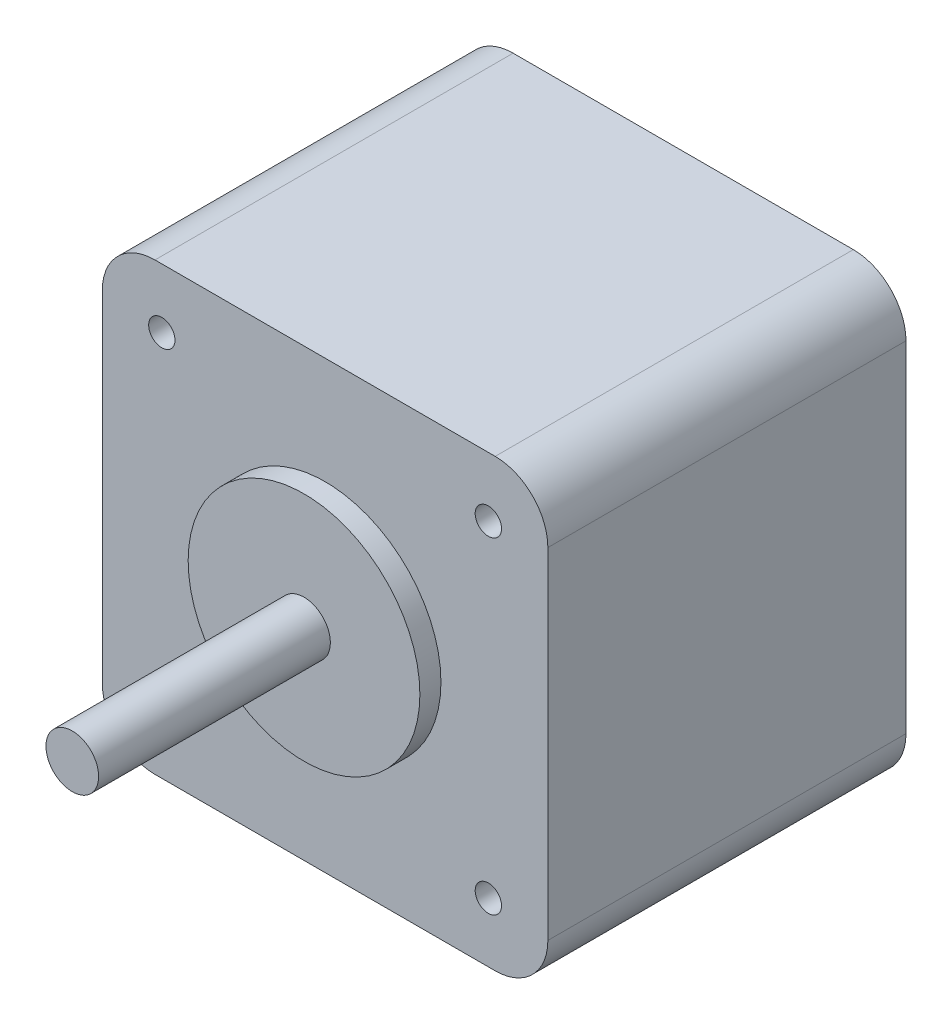
ISO-10303-21;
HEADER;
FILE_DESCRIPTION(('STEP AP214'),'2;1');
FILE_NAME('part.step','',(''),(''),'','','');
FILE_SCHEMA(('AUTOMOTIVE_DESIGN { 1 0 10303 214 1 1 1 1 }'));
ENDSEC;
DATA;
#1=APPLICATION_CONTEXT('core data for automotive mechanical design processes');
#2=APPLICATION_PROTOCOL_DEFINITION('international standard','automotive_design',2000,#1);
#3=PRODUCT_CONTEXT('',#1,'mechanical');
#4=PRODUCT('Part','Part','',(#3));
#5=PRODUCT_RELATED_PRODUCT_CATEGORY('part','',(#4));
#6=PRODUCT_DEFINITION_FORMATION('','',#4);
#7=PRODUCT_DEFINITION_CONTEXT('part definition',#1,'design');
#8=PRODUCT_DEFINITION('design','',#6,#7);
#9=PRODUCT_DEFINITION_SHAPE('','',#8);
#10=(LENGTH_UNIT() NAMED_UNIT(*) SI_UNIT(.MILLI.,.METRE.));
#11=(NAMED_UNIT(*) PLANE_ANGLE_UNIT() SI_UNIT($,.RADIAN.));
#12=(NAMED_UNIT(*) SI_UNIT($,.STERADIAN.) SOLID_ANGLE_UNIT());
#13=UNCERTAINTY_MEASURE_WITH_UNIT(LENGTH_MEASURE(1.E-05),#10,'distance_accuracy_value','');
#14=(GEOMETRIC_REPRESENTATION_CONTEXT(3) GLOBAL_UNCERTAINTY_ASSIGNED_CONTEXT((#13)) GLOBAL_UNIT_ASSIGNED_CONTEXT((#10,
#11,#12)) REPRESENTATION_CONTEXT('',''));
#15=CARTESIAN_POINT('',(0.,0.,0.));
#16=DIRECTION('',(0.,0.,1.));
#17=DIRECTION('',(1.,0.,0.));
#18=AXIS2_PLACEMENT_3D('',#15,#16,#17);
#19=CARTESIAN_POINT('',(21.15,21.15,36.));
#20=DIRECTION('',(0.,0.,1.));
#21=DIRECTION('',(1.,0.,0.));
#22=AXIS2_PLACEMENT_3D('',#19,#20,#21);
#23=PLANE('',#22);
#24=CARTESIAN_POINT('',(21.15,21.15,36.));
#25=DIRECTION('',(0.,0.,1.));
#26=DIRECTION('',(1.,0.,0.));
#27=AXIS2_PLACEMENT_3D('',#24,#25,#26);
#28=CIRCLE('',#27,11.);
#29=CARTESIAN_POINT('',(32.15,21.15,36.));
#30=VERTEX_POINT('',#29);
#31=EDGE_CURVE('E144',#30,#30,#28,.T.);
#32=ORIENTED_EDGE('',*,*,#31,.T.);
#33=EDGE_LOOP('',(#32));
#34=FACE_BOUND('',#33,.T.);
#35=CARTESIAN_POINT('',(21.15,21.15,36.));
#36=DIRECTION('',(0.,0.,1.));
#37=DIRECTION('',(1.,0.,0.));
#38=AXIS2_PLACEMENT_3D('',#35,#36,#37);
#39=CIRCLE('',#38,2.5);
#40=CARTESIAN_POINT('',(23.65,21.15,36.));
#41=VERTEX_POINT('',#40);
#42=EDGE_CURVE('E195',#41,#41,#39,.T.);
#43=ORIENTED_EDGE('',*,*,#42,.F.);
#44=EDGE_LOOP('',(#43));
#45=FACE_BOUND('',#44,.T.);
#46=ADVANCED_FACE('F38',(#34,#45),#23,.T.);
#47=CARTESIAN_POINT('',(5.,5.,34.));
#48=DIRECTION('',(0.,0.,-1.));
#49=DIRECTION('',(-1.,0.,0.));
#50=AXIS2_PLACEMENT_3D('',#47,#48,#49);
#51=PLANE('',#50);
#52=CARTESIAN_POINT('',(5.65,36.65,34.));
#53=DIRECTION('',(0.,0.,1.));
#54=DIRECTION('',(1.,0.,0.));
#55=AXIS2_PLACEMENT_3D('',#52,#53,#54);
#56=CIRCLE('',#55,1.25);
#57=CARTESIAN_POINT('',(6.89999999999999,36.65,34.));
#58=VERTEX_POINT('',#57);
#59=EDGE_CURVE('E221',#58,#58,#56,.T.);
#60=ORIENTED_EDGE('',*,*,#59,.F.);
#61=EDGE_LOOP('',(#60));
#62=FACE_BOUND('',#61,.T.);
#63=CARTESIAN_POINT('',(36.65,36.65,34.));
#64=DIRECTION('',(0.,0.,1.));
#65=DIRECTION('',(1.,0.,0.));
#66=AXIS2_PLACEMENT_3D('',#63,#64,#65);
#67=CIRCLE('',#66,1.25);
#68=CARTESIAN_POINT('',(37.9,36.65,34.));
#69=VERTEX_POINT('',#68);
#70=EDGE_CURVE('E215',#69,#69,#67,.T.);
#71=ORIENTED_EDGE('',*,*,#70,.F.);
#72=EDGE_LOOP('',(#71));
#73=FACE_BOUND('',#72,.T.);
#74=CARTESIAN_POINT('',(36.65,5.65,34.));
#75=DIRECTION('',(0.,0.,1.));
#76=DIRECTION('',(1.,0.,0.));
#77=AXIS2_PLACEMENT_3D('',#74,#75,#76);
#78=CIRCLE('',#77,1.25);
#79=CARTESIAN_POINT('',(37.9,5.65,34.));
#80=VERTEX_POINT('',#79);
#81=EDGE_CURVE('E209',#80,#80,#78,.T.);
#82=ORIENTED_EDGE('',*,*,#81,.F.);
#83=EDGE_LOOP('',(#82));
#84=FACE_BOUND('',#83,.T.);
#85=CARTESIAN_POINT('',(5.65,5.65,34.));
#86=DIRECTION('',(0.,0.,1.));
#87=DIRECTION('',(1.,0.,0.));
#88=AXIS2_PLACEMENT_3D('',#85,#86,#87);
#89=CIRCLE('',#88,1.25);
#90=CARTESIAN_POINT('',(6.89999999999999,5.65,34.));
#91=VERTEX_POINT('',#90);
#92=EDGE_CURVE('E203',#91,#91,#89,.T.);
#93=ORIENTED_EDGE('',*,*,#92,.F.);
#94=EDGE_LOOP('',(#93));
#95=FACE_BOUND('',#94,.T.);
#96=CARTESIAN_POINT('',(5.,5.,34.));
#97=DIRECTION('',(0.,0.,1.));
#98=DIRECTION('',(-1.,0.,0.));
#99=AXIS2_PLACEMENT_3D('',#96,#97,#98);
#100=CIRCLE('',#99,5.);
#101=CARTESIAN_POINT('',(0.,5.00000000000004,34.));
#102=VERTEX_POINT('',#101);
#103=CARTESIAN_POINT('',(5.00000000000004,0.,34.));
#104=VERTEX_POINT('',#103);
#105=EDGE_CURVE('E155',#102,#104,#100,.T.);
#106=ORIENTED_EDGE('',*,*,#105,.T.);
#107=DIRECTION('',(1.,0.,0.));
#108=VECTOR('',#107,1.);
#109=CARTESIAN_POINT('',(5.00000000000004,0.,34.));
#110=LINE('',#109,#108);
#111=CARTESIAN_POINT('',(37.3,0.,34.));
#112=VERTEX_POINT('',#111);
#113=EDGE_CURVE('E100',#104,#112,#110,.T.);
#114=ORIENTED_EDGE('',*,*,#113,.T.);
#115=CARTESIAN_POINT('',(37.3,5.,34.));
#116=DIRECTION('',(0.,0.,1.));
#117=DIRECTION('',(1.,0.,0.));
#118=AXIS2_PLACEMENT_3D('',#115,#116,#117);
#119=CIRCLE('',#118,5.);
#120=CARTESIAN_POINT('',(42.3,5.00000000000004,34.));
#121=VERTEX_POINT('',#120);
#122=EDGE_CURVE('E186',#112,#121,#119,.T.);
#123=ORIENTED_EDGE('',*,*,#122,.T.);
#124=DIRECTION('',(0.,1.,0.));
#125=VECTOR('',#124,1.);
#126=CARTESIAN_POINT('',(42.3,5.00000000000004,34.));
#127=LINE('',#126,#125);
#128=CARTESIAN_POINT('',(42.3,37.3,34.));
#129=VERTEX_POINT('',#128);
#130=EDGE_CURVE('E185',#121,#129,#127,.T.);
#131=ORIENTED_EDGE('',*,*,#130,.T.);
#132=CARTESIAN_POINT('',(37.3,37.3,34.));
#133=DIRECTION('',(0.,0.,1.));
#134=DIRECTION('',(-1.,0.,0.));
#135=AXIS2_PLACEMENT_3D('',#132,#133,#134);
#136=CIRCLE('',#135,5.);
#137=CARTESIAN_POINT('',(37.3,42.3,34.));
#138=VERTEX_POINT('',#137);
#139=EDGE_CURVE('E122',#129,#138,#136,.T.);
#140=ORIENTED_EDGE('',*,*,#139,.T.);
#141=DIRECTION('',(-1.,0.,0.));
#142=VECTOR('',#141,1.);
#143=CARTESIAN_POINT('',(5.00000000000003,42.3,34.));
#144=LINE('',#143,#142);
#145=CARTESIAN_POINT('',(5.00000000000003,42.3,34.));
#146=VERTEX_POINT('',#145);
#147=EDGE_CURVE('E115',#138,#146,#144,.T.);
#148=ORIENTED_EDGE('',*,*,#147,.T.);
#149=CARTESIAN_POINT('',(5.,37.3,34.));
#150=DIRECTION('',(0.,0.,1.));
#151=DIRECTION('',(-1.,0.,0.));
#152=AXIS2_PLACEMENT_3D('',#149,#150,#151);
#153=CIRCLE('',#152,5.);
#154=CARTESIAN_POINT('',(0.,37.3,34.));
#155=VERTEX_POINT('',#154);
#156=EDGE_CURVE('E120',#146,#155,#153,.T.);
#157=ORIENTED_EDGE('',*,*,#156,.T.);
#158=DIRECTION('',(0.,-1.,0.));
#159=VECTOR('',#158,1.);
#160=CARTESIAN_POINT('',(0.,5.00000000000004,34.));
#161=LINE('',#160,#159);
#162=EDGE_CURVE('E55',#155,#102,#161,.T.);
#163=ORIENTED_EDGE('',*,*,#162,.T.);
#164=EDGE_LOOP('',(#106,#114,#123,#131,#140,#148,#157,#163));
#165=FACE_BOUND('',#164,.T.);
#166=CARTESIAN_POINT('',(21.15,21.15,34.));
#167=DIRECTION('',(0.,0.,-1.));
#168=DIRECTION('',(-1.,0.,0.));
#169=AXIS2_PLACEMENT_3D('',#166,#167,#168);
#170=CIRCLE('',#169,11.);
#171=CARTESIAN_POINT('',(10.15,21.15,34.));
#172=VERTEX_POINT('',#171);
#173=EDGE_CURVE('E11',#172,#172,#170,.F.);
#174=ORIENTED_EDGE('',*,*,#173,.F.);
#175=EDGE_LOOP('',(#174));
#176=FACE_BOUND('',#175,.T.);
#177=ADVANCED_FACE('F117',(#62,#73,#84,#95,#165,#176),#51,.F.);
#178=CARTESIAN_POINT('',(5.,5.,34.));
#179=DIRECTION('',(0.,0.,-1.));
#180=DIRECTION('',(-1.,0.,0.));
#181=AXIS2_PLACEMENT_3D('',#178,#179,#180);
#182=CYLINDRICAL_SURFACE('',#181,5.);
#183=CARTESIAN_POINT('',(5.,5.,0.));
#184=DIRECTION('',(0.,0.,1.));
#185=DIRECTION('',(-1.,0.,0.));
#186=AXIS2_PLACEMENT_3D('',#183,#184,#185);
#187=CIRCLE('',#186,5.);
#188=CARTESIAN_POINT('',(0.,5.00000000000004,0.));
#189=VERTEX_POINT('',#188);
#190=CARTESIAN_POINT('',(5.00000000000004,0.,0.));
#191=VERTEX_POINT('',#190);
#192=EDGE_CURVE('E140',#189,#191,#187,.T.);
#193=ORIENTED_EDGE('',*,*,#192,.T.);
#194=DIRECTION('',(0.,0.,-1.));
#195=VECTOR('',#194,1.);
#196=CARTESIAN_POINT('',(5.00000000000004,0.,34.));
#197=LINE('',#196,#195);
#198=EDGE_CURVE('E47',#104,#191,#197,.T.);
#199=ORIENTED_EDGE('',*,*,#198,.F.);
#200=ORIENTED_EDGE('',*,*,#105,.F.);
#201=DIRECTION('',(0.,0.,-1.));
#202=VECTOR('',#201,1.);
#203=CARTESIAN_POINT('',(0.,5.00000000000004,34.));
#204=LINE('',#203,#202);
#205=EDGE_CURVE('E136',#102,#189,#204,.T.);
#206=ORIENTED_EDGE('',*,*,#205,.T.);
#207=EDGE_LOOP('',(#193,#199,#200,#206));
#208=FACE_BOUND('',#207,.T.);
#209=ADVANCED_FACE('F40',(#208),#182,.T.);
#210=CARTESIAN_POINT('',(5.00000000000004,0.,34.));
#211=DIRECTION('',(0.,1.,0.));
#212=DIRECTION('',(0.,0.,1.));
#213=AXIS2_PLACEMENT_3D('',#210,#211,#212);
#214=PLANE('',#213);
#215=DIRECTION('',(1.,0.,0.));
#216=VECTOR('',#215,1.);
#217=CARTESIAN_POINT('',(5.00000000000004,0.,0.));
#218=LINE('',#217,#216);
#219=CARTESIAN_POINT('',(37.3,0.,0.));
#220=VERTEX_POINT('',#219);
#221=EDGE_CURVE('E143',#191,#220,#218,.T.);
#222=ORIENTED_EDGE('',*,*,#221,.T.);
#223=DIRECTION('',(0.,0.,-1.));
#224=VECTOR('',#223,1.);
#225=CARTESIAN_POINT('',(37.3,0.,34.));
#226=LINE('',#225,#224);
#227=EDGE_CURVE('E165',#112,#220,#226,.T.);
#228=ORIENTED_EDGE('',*,*,#227,.F.);
#229=ORIENTED_EDGE('',*,*,#113,.F.);
#230=ORIENTED_EDGE('',*,*,#198,.T.);
#231=EDGE_LOOP('',(#222,#228,#229,#230));
#232=FACE_BOUND('',#231,.T.);
#233=ADVANCED_FACE('F168',(#232),#214,.F.);
#234=CARTESIAN_POINT('',(37.3,5.,34.));
#235=DIRECTION('',(0.,0.,-1.));
#236=DIRECTION('',(-1.,0.,0.));
#237=AXIS2_PLACEMENT_3D('',#234,#235,#236);
#238=CYLINDRICAL_SURFACE('',#237,5.);
#239=CARTESIAN_POINT('',(37.3,5.,0.));
#240=DIRECTION('',(0.,0.,1.));
#241=DIRECTION('',(1.,0.,0.));
#242=AXIS2_PLACEMENT_3D('',#239,#240,#241);
#243=CIRCLE('',#242,5.);
#244=CARTESIAN_POINT('',(42.3,5.00000000000004,0.));
#245=VERTEX_POINT('',#244);
#246=EDGE_CURVE('E146',#220,#245,#243,.T.);
#247=ORIENTED_EDGE('',*,*,#246,.T.);
#248=DIRECTION('',(0.,0.,-1.));
#249=VECTOR('',#248,1.);
#250=CARTESIAN_POINT('',(42.3,5.00000000000004,34.));
#251=LINE('',#250,#249);
#252=EDGE_CURVE('E162',#121,#245,#251,.T.);
#253=ORIENTED_EDGE('',*,*,#252,.F.);
#254=ORIENTED_EDGE('',*,*,#122,.F.);
#255=ORIENTED_EDGE('',*,*,#227,.T.);
#256=EDGE_LOOP('',(#247,#253,#254,#255));
#257=FACE_BOUND('',#256,.T.);
#258=ADVANCED_FACE('F179',(#257),#238,.T.);
#259=CARTESIAN_POINT('',(42.3,5.00000000000004,34.));
#260=DIRECTION('',(-1.,0.,0.));
#261=DIRECTION('',(0.,0.,1.));
#262=AXIS2_PLACEMENT_3D('',#259,#260,#261);
#263=PLANE('',#262);
#264=DIRECTION('',(0.,1.,0.));
#265=VECTOR('',#264,1.);
#266=CARTESIAN_POINT('',(42.3,5.00000000000004,0.));
#267=LINE('',#266,#265);
#268=CARTESIAN_POINT('',(42.3,37.3,0.));
#269=VERTEX_POINT('',#268);
#270=EDGE_CURVE('E148',#245,#269,#267,.T.);
#271=ORIENTED_EDGE('',*,*,#270,.T.);
#272=DIRECTION('',(0.,0.,-1.));
#273=VECTOR('',#272,1.);
#274=CARTESIAN_POINT('',(42.3,37.3,34.));
#275=LINE('',#274,#273);
#276=EDGE_CURVE('E159',#129,#269,#275,.T.);
#277=ORIENTED_EDGE('',*,*,#276,.F.);
#278=ORIENTED_EDGE('',*,*,#130,.F.);
#279=ORIENTED_EDGE('',*,*,#252,.T.);
#280=EDGE_LOOP('',(#271,#277,#278,#279));
#281=FACE_BOUND('',#280,.T.);
#282=ADVANCED_FACE('F183',(#281),#263,.F.);
#283=CARTESIAN_POINT('',(37.3,37.3,34.));
#284=DIRECTION('',(0.,0.,-1.));
#285=DIRECTION('',(-1.,0.,0.));
#286=AXIS2_PLACEMENT_3D('',#283,#284,#285);
#287=CYLINDRICAL_SURFACE('',#286,5.);
#288=CARTESIAN_POINT('',(37.3,37.3,0.));
#289=DIRECTION('',(0.,0.,1.));
#290=DIRECTION('',(-1.,0.,0.));
#291=AXIS2_PLACEMENT_3D('',#288,#289,#290);
#292=CIRCLE('',#291,5.);
#293=CARTESIAN_POINT('',(37.3,42.3,0.));
#294=VERTEX_POINT('',#293);
#295=EDGE_CURVE('E150',#269,#294,#292,.T.);
#296=ORIENTED_EDGE('',*,*,#295,.T.);
#297=DIRECTION('',(0.,0.,-1.));
#298=VECTOR('',#297,1.);
#299=CARTESIAN_POINT('',(37.3,42.3,34.));
#300=LINE('',#299,#298);
#301=EDGE_CURVE('E131',#138,#294,#300,.T.);
#302=ORIENTED_EDGE('',*,*,#301,.F.);
#303=ORIENTED_EDGE('',*,*,#139,.F.);
#304=ORIENTED_EDGE('',*,*,#276,.T.);
#305=EDGE_LOOP('',(#296,#302,#303,#304));
#306=FACE_BOUND('',#305,.T.);
#307=ADVANCED_FACE('F276',(#306),#287,.T.);
#308=CARTESIAN_POINT('',(5.00000000000003,42.3,34.));
#309=DIRECTION('',(0.,-1.,0.));
#310=DIRECTION('',(0.,0.,-1.));
#311=AXIS2_PLACEMENT_3D('',#308,#309,#310);
#312=PLANE('',#311);
#313=DIRECTION('',(-1.,0.,0.));
#314=VECTOR('',#313,1.);
#315=CARTESIAN_POINT('',(5.00000000000003,42.3,0.));
#316=LINE('',#315,#314);
#317=CARTESIAN_POINT('',(5.00000000000003,42.3,0.));
#318=VERTEX_POINT('',#317);
#319=EDGE_CURVE('E130',#294,#318,#316,.T.);
#320=ORIENTED_EDGE('',*,*,#319,.T.);
#321=DIRECTION('',(0.,0.,-1.));
#322=VECTOR('',#321,1.);
#323=CARTESIAN_POINT('',(5.00000000000003,42.3,34.));
#324=LINE('',#323,#322);
#325=EDGE_CURVE('E127',#146,#318,#324,.T.);
#326=ORIENTED_EDGE('',*,*,#325,.F.);
#327=ORIENTED_EDGE('',*,*,#147,.F.);
#328=ORIENTED_EDGE('',*,*,#301,.T.);
#329=EDGE_LOOP('',(#320,#326,#327,#328));
#330=FACE_BOUND('',#329,.T.);
#331=ADVANCED_FACE('F128',(#330),#312,.F.);
#332=CARTESIAN_POINT('',(5.,37.3,34.));
#333=DIRECTION('',(0.,0.,-1.));
#334=DIRECTION('',(-1.,0.,0.));
#335=AXIS2_PLACEMENT_3D('',#332,#333,#334);
#336=CYLINDRICAL_SURFACE('',#335,5.);
#337=CARTESIAN_POINT('',(5.,37.3,0.));
#338=DIRECTION('',(0.,0.,1.));
#339=DIRECTION('',(-1.,0.,0.));
#340=AXIS2_PLACEMENT_3D('',#337,#338,#339);
#341=CIRCLE('',#340,5.);
#342=CARTESIAN_POINT('',(0.,37.3,0.));
#343=VERTEX_POINT('',#342);
#344=EDGE_CURVE('E85',#318,#343,#341,.T.);
#345=ORIENTED_EDGE('',*,*,#344,.T.);
#346=DIRECTION('',(0.,0.,-1.));
#347=VECTOR('',#346,1.);
#348=CARTESIAN_POINT('',(0.,37.3,34.));
#349=LINE('',#348,#347);
#350=EDGE_CURVE('E132',#155,#343,#349,.T.);
#351=ORIENTED_EDGE('',*,*,#350,.F.);
#352=ORIENTED_EDGE('',*,*,#156,.F.);
#353=ORIENTED_EDGE('',*,*,#325,.T.);
#354=EDGE_LOOP('',(#345,#351,#352,#353));
#355=FACE_BOUND('',#354,.T.);
#356=ADVANCED_FACE('F134',(#355),#336,.T.);
#357=CARTESIAN_POINT('',(0.,5.00000000000004,34.));
#358=DIRECTION('',(1.,0.,0.));
#359=DIRECTION('',(0.,0.,-1.));
#360=AXIS2_PLACEMENT_3D('',#357,#358,#359);
#361=PLANE('',#360);
#362=DIRECTION('',(0.,-1.,0.));
#363=VECTOR('',#362,1.);
#364=CARTESIAN_POINT('',(0.,5.00000000000004,0.));
#365=LINE('',#364,#363);
#366=EDGE_CURVE('E91',#343,#189,#365,.T.);
#367=ORIENTED_EDGE('',*,*,#366,.T.);
#368=ORIENTED_EDGE('',*,*,#205,.F.);
#369=ORIENTED_EDGE('',*,*,#162,.F.);
#370=ORIENTED_EDGE('',*,*,#350,.T.);
#371=EDGE_LOOP('',(#367,#368,#369,#370));
#372=FACE_BOUND('',#371,.T.);
#373=ADVANCED_FACE('F269',(#372),#361,.F.);
#374=CARTESIAN_POINT('',(5.,5.,0.));
#375=DIRECTION('',(0.,0.,-1.));
#376=DIRECTION('',(-1.,0.,0.));
#377=AXIS2_PLACEMENT_3D('',#374,#375,#376);
#378=PLANE('',#377);
#379=ORIENTED_EDGE('',*,*,#192,.F.);
#380=ORIENTED_EDGE('',*,*,#366,.F.);
#381=ORIENTED_EDGE('',*,*,#344,.F.);
#382=ORIENTED_EDGE('',*,*,#319,.F.);
#383=ORIENTED_EDGE('',*,*,#295,.F.);
#384=ORIENTED_EDGE('',*,*,#270,.F.);
#385=ORIENTED_EDGE('',*,*,#246,.F.);
#386=ORIENTED_EDGE('',*,*,#221,.F.);
#387=EDGE_LOOP('',(#379,#380,#381,#382,#383,#384,#385,#386));
#388=FACE_BOUND('',#387,.T.);
#389=ADVANCED_FACE('F173',(#388),#378,.T.);
#390=CARTESIAN_POINT('',(21.15,21.15,36.));
#391=DIRECTION('',(0.,0.,-1.));
#392=DIRECTION('',(-1.,0.,0.));
#393=AXIS2_PLACEMENT_3D('',#390,#391,#392);
#394=CYLINDRICAL_SURFACE('',#393,11.);
#395=ORIENTED_EDGE('',*,*,#31,.F.);
#396=EDGE_LOOP('',(#395));
#397=FACE_BOUND('',#396,.T.);
#398=ORIENTED_EDGE('',*,*,#173,.T.);
#399=EDGE_LOOP('',(#398));
#400=FACE_BOUND('',#399,.T.);
#401=ADVANCED_FACE('F263',(#397,#400),#394,.T.);
#402=CARTESIAN_POINT('',(21.15,21.15,58.));
#403=DIRECTION('',(0.,0.,-1.));
#404=DIRECTION('',(-1.,0.,0.));
#405=AXIS2_PLACEMENT_3D('',#402,#403,#404);
#406=CYLINDRICAL_SURFACE('',#405,2.5);
#407=CARTESIAN_POINT('',(21.15,21.15,58.));
#408=DIRECTION('',(0.,0.,1.));
#409=DIRECTION('',(1.,0.,0.));
#410=AXIS2_PLACEMENT_3D('',#407,#408,#409);
#411=CIRCLE('',#410,2.5);
#412=CARTESIAN_POINT('',(23.65,21.15,58.));
#413=VERTEX_POINT('',#412);
#414=EDGE_CURVE('E194',#413,#413,#411,.T.);
#415=ORIENTED_EDGE('',*,*,#414,.F.);
#416=EDGE_LOOP('',(#415));
#417=FACE_BOUND('',#416,.T.);
#418=ORIENTED_EDGE('',*,*,#42,.T.);
#419=EDGE_LOOP('',(#418));
#420=FACE_BOUND('',#419,.T.);
#421=ADVANCED_FACE('F261',(#417,#420),#406,.T.);
#422=CARTESIAN_POINT('',(21.15,21.15,58.));
#423=DIRECTION('',(0.,0.,1.));
#424=DIRECTION('',(1.,0.,0.));
#425=AXIS2_PLACEMENT_3D('',#422,#423,#424);
#426=PLANE('',#425);
#427=ORIENTED_EDGE('',*,*,#414,.T.);
#428=EDGE_LOOP('',(#427));
#429=FACE_BOUND('',#428,.T.);
#430=ADVANCED_FACE('F249',(#429),#426,.T.);
#431=CARTESIAN_POINT('',(5.65,5.65,25.5));
#432=DIRECTION('',(0.,0.,1.));
#433=DIRECTION('',(1.,0.,0.));
#434=AXIS2_PLACEMENT_3D('',#431,#432,#433);
#435=CONICAL_SURFACE('',#434,1.25,1.02974425867665);
#436=CARTESIAN_POINT('',(5.64999999999999,5.65,24.7489242262155));
#437=VERTEX_POINT('',#436);
#438=VERTEX_LOOP('',#437);
#439=FACE_BOUND('',#438,.T.);
#440=CARTESIAN_POINT('',(5.65,5.65,25.5));
#441=DIRECTION('',(0.,0.,1.));
#442=DIRECTION('',(1.,0.,0.));
#443=AXIS2_PLACEMENT_3D('',#440,#441,#442);
#444=CIRCLE('',#443,1.25);
#445=CARTESIAN_POINT('',(6.89999999999999,5.65,25.5));
#446=VERTEX_POINT('',#445);
#447=EDGE_CURVE('E198',#446,#446,#444,.T.);
#448=ORIENTED_EDGE('',*,*,#447,.T.);
#449=EDGE_LOOP('',(#448));
#450=FACE_BOUND('',#449,.T.);
#451=ADVANCED_FACE('F239',(#439,#450),#435,.F.);
#452=CARTESIAN_POINT('',(5.65,5.65,34.));
#453=DIRECTION('',(0.,0.,1.));
#454=DIRECTION('',(1.,0.,0.));
#455=AXIS2_PLACEMENT_3D('',#452,#453,#454);
#456=CYLINDRICAL_SURFACE('',#455,1.25);
#457=ORIENTED_EDGE('',*,*,#447,.F.);
#458=EDGE_LOOP('',(#457));
#459=FACE_BOUND('',#458,.T.);
#460=ORIENTED_EDGE('',*,*,#92,.T.);
#461=EDGE_LOOP('',(#460));
#462=FACE_BOUND('',#461,.T.);
#463=ADVANCED_FACE('F236',(#459,#462),#456,.F.);
#464=CARTESIAN_POINT('',(36.65,5.65,25.5));
#465=DIRECTION('',(0.,0.,1.));
#466=DIRECTION('',(1.,0.,0.));
#467=AXIS2_PLACEMENT_3D('',#464,#465,#466);
#468=CONICAL_SURFACE('',#467,1.24999999999999,1.02974425867665);
#469=CARTESIAN_POINT('',(36.65,5.65,24.7489242262155));
#470=VERTEX_POINT('',#469);
#471=VERTEX_LOOP('',#470);
#472=FACE_BOUND('',#471,.T.);
#473=CARTESIAN_POINT('',(36.65,5.65,25.5));
#474=DIRECTION('',(0.,0.,1.));
#475=DIRECTION('',(1.,0.,0.));
#476=AXIS2_PLACEMENT_3D('',#473,#474,#475);
#477=CIRCLE('',#476,1.24999999999999);
#478=CARTESIAN_POINT('',(37.9,5.65,25.5));
#479=VERTEX_POINT('',#478);
#480=EDGE_CURVE('E206',#479,#479,#477,.T.);
#481=ORIENTED_EDGE('',*,*,#480,.T.);
#482=EDGE_LOOP('',(#481));
#483=FACE_BOUND('',#482,.T.);
#484=ADVANCED_FACE('F238',(#472,#483),#468,.F.);
#485=CARTESIAN_POINT('',(36.65,5.65,34.));
#486=DIRECTION('',(0.,0.,1.));
#487=DIRECTION('',(1.,0.,0.));
#488=AXIS2_PLACEMENT_3D('',#485,#486,#487);
#489=CYLINDRICAL_SURFACE('',#488,1.25);
#490=ORIENTED_EDGE('',*,*,#480,.F.);
#491=EDGE_LOOP('',(#490));
#492=FACE_BOUND('',#491,.T.);
#493=ORIENTED_EDGE('',*,*,#81,.T.);
#494=EDGE_LOOP('',(#493));
#495=FACE_BOUND('',#494,.T.);
#496=ADVANCED_FACE('F246',(#492,#495),#489,.F.);
#497=CARTESIAN_POINT('',(36.65,36.65,25.5));
#498=DIRECTION('',(0.,0.,1.));
#499=DIRECTION('',(1.,0.,0.));
#500=AXIS2_PLACEMENT_3D('',#497,#498,#499);
#501=CONICAL_SURFACE('',#500,1.24999999999999,1.02974425867665);
#502=CARTESIAN_POINT('',(36.65,36.65,24.7489242262155));
#503=VERTEX_POINT('',#502);
#504=VERTEX_LOOP('',#503);
#505=FACE_BOUND('',#504,.T.);
#506=CARTESIAN_POINT('',(36.65,36.65,25.5));
#507=DIRECTION('',(0.,0.,1.));
#508=DIRECTION('',(1.,0.,0.));
#509=AXIS2_PLACEMENT_3D('',#506,#507,#508);
#510=CIRCLE('',#509,1.24999999999999);
#511=CARTESIAN_POINT('',(37.9,36.65,25.5));
#512=VERTEX_POINT('',#511);
#513=EDGE_CURVE('E212',#512,#512,#510,.T.);
#514=ORIENTED_EDGE('',*,*,#513,.T.);
#515=EDGE_LOOP('',(#514));
#516=FACE_BOUND('',#515,.T.);
#517=ADVANCED_FACE('F329',(#505,#516),#501,.F.);
#518=CARTESIAN_POINT('',(36.65,36.65,34.));
#519=DIRECTION('',(0.,0.,1.));
#520=DIRECTION('',(1.,0.,0.));
#521=AXIS2_PLACEMENT_3D('',#518,#519,#520);
#522=CYLINDRICAL_SURFACE('',#521,1.25);
#523=ORIENTED_EDGE('',*,*,#513,.F.);
#524=EDGE_LOOP('',(#523));
#525=FACE_BOUND('',#524,.T.);
#526=ORIENTED_EDGE('',*,*,#70,.T.);
#527=EDGE_LOOP('',(#526));
#528=FACE_BOUND('',#527,.T.);
#529=ADVANCED_FACE('F341',(#525,#528),#522,.F.);
#530=CARTESIAN_POINT('',(5.65,36.65,25.5));
#531=DIRECTION('',(0.,0.,1.));
#532=DIRECTION('',(1.,0.,0.));
#533=AXIS2_PLACEMENT_3D('',#530,#531,#532);
#534=CONICAL_SURFACE('',#533,1.25,1.02974425867665);
#535=CARTESIAN_POINT('',(5.64999999999999,36.65,24.7489242262155));
#536=VERTEX_POINT('',#535);
#537=VERTEX_LOOP('',#536);
#538=FACE_BOUND('',#537,.T.);
#539=CARTESIAN_POINT('',(5.65,36.65,25.5));
#540=DIRECTION('',(0.,0.,1.));
#541=DIRECTION('',(1.,0.,0.));
#542=AXIS2_PLACEMENT_3D('',#539,#540,#541);
#543=CIRCLE('',#542,1.25);
#544=CARTESIAN_POINT('',(6.89999999999999,36.65,25.5));
#545=VERTEX_POINT('',#544);
#546=EDGE_CURVE('E218',#545,#545,#543,.T.);
#547=ORIENTED_EDGE('',*,*,#546,.T.);
#548=EDGE_LOOP('',(#547));
#549=FACE_BOUND('',#548,.T.);
#550=ADVANCED_FACE('F351',(#538,#549),#534,.F.);
#551=CARTESIAN_POINT('',(5.65,36.65,34.));
#552=DIRECTION('',(0.,0.,1.));
#553=DIRECTION('',(1.,0.,0.));
#554=AXIS2_PLACEMENT_3D('',#551,#552,#553);
#555=CYLINDRICAL_SURFACE('',#554,1.25);
#556=ORIENTED_EDGE('',*,*,#546,.F.);
#557=EDGE_LOOP('',(#556));
#558=FACE_BOUND('',#557,.T.);
#559=ORIENTED_EDGE('',*,*,#59,.T.);
#560=EDGE_LOOP('',(#559));
#561=FACE_BOUND('',#560,.T.);
#562=ADVANCED_FACE('F225',(#558,#561),#555,.F.);
#563=CLOSED_SHELL('',(#46,#177,#209,#233,#258,#282,#307,#331,#356,#373,#389,#401,#421,#430,#451,
#463,#484,#496,#517,#529,#550,#562));
#564=MANIFOLD_SOLID_BREP('B2',#563);
#565=ADVANCED_BREP_SHAPE_REPRESENTATION('',(#18,#564),#14);
#566=SHAPE_DEFINITION_REPRESENTATION(#9,#565);
ENDSEC;
END-ISO-10303-21;
